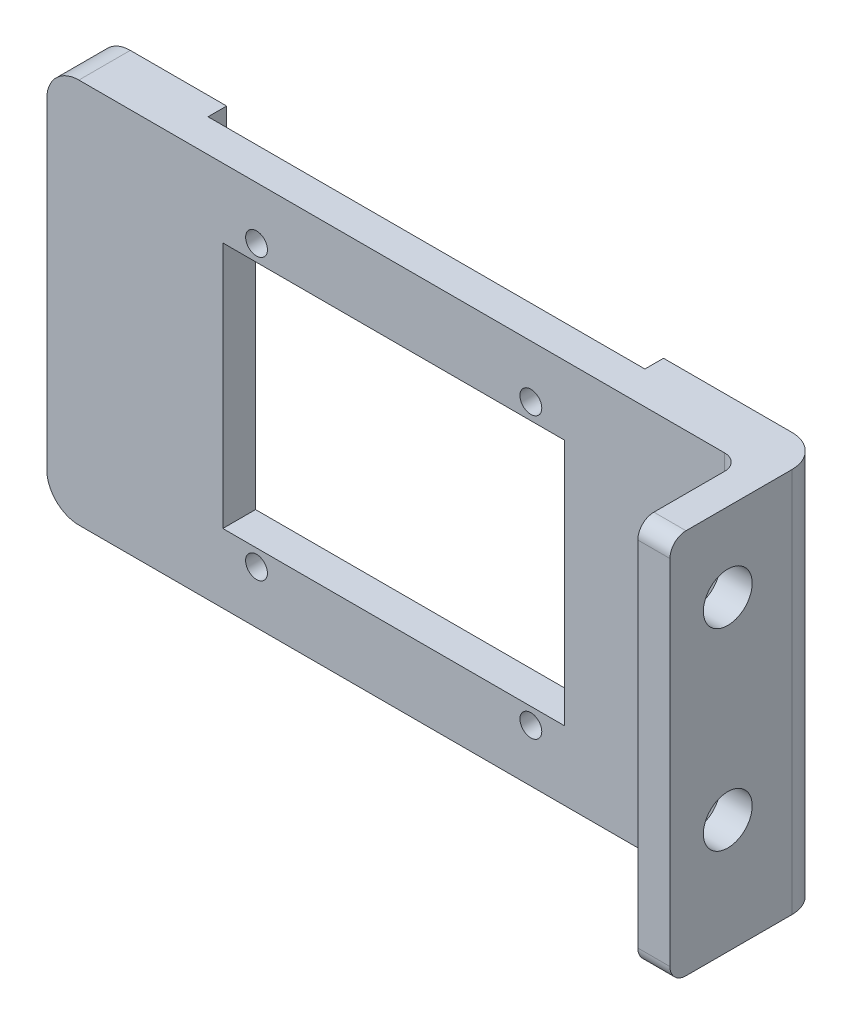
ISO-10303-21;
HEADER;
FILE_DESCRIPTION(('STEP AP214'),'2;1');
FILE_NAME('part.step','',(''),(''),'','','');
FILE_SCHEMA(('AUTOMOTIVE_DESIGN { 1 0 10303 214 1 1 1 1 }'));
ENDSEC;
DATA;
#1=APPLICATION_CONTEXT('core data for automotive mechanical design processes');
#2=APPLICATION_PROTOCOL_DEFINITION('international standard','automotive_design',2000,#1);
#3=PRODUCT_CONTEXT('',#1,'mechanical');
#4=PRODUCT('Part','Part','',(#3));
#5=PRODUCT_RELATED_PRODUCT_CATEGORY('part','',(#4));
#6=PRODUCT_DEFINITION_FORMATION('','',#4);
#7=PRODUCT_DEFINITION_CONTEXT('part definition',#1,'design');
#8=PRODUCT_DEFINITION('design','',#6,#7);
#9=PRODUCT_DEFINITION_SHAPE('','',#8);
#10=(LENGTH_UNIT() NAMED_UNIT(*) SI_UNIT(.MILLI.,.METRE.));
#11=(NAMED_UNIT(*) PLANE_ANGLE_UNIT() SI_UNIT($,.RADIAN.));
#12=(NAMED_UNIT(*) SI_UNIT($,.STERADIAN.) SOLID_ANGLE_UNIT());
#13=UNCERTAINTY_MEASURE_WITH_UNIT(LENGTH_MEASURE(1.E-05),#10,'distance_accuracy_value','');
#14=(GEOMETRIC_REPRESENTATION_CONTEXT(3) GLOBAL_UNCERTAINTY_ASSIGNED_CONTEXT((#13)) GLOBAL_UNIT_ASSIGNED_CONTEXT((#10,
#11,#12)) REPRESENTATION_CONTEXT('',''));
#15=CARTESIAN_POINT('',(0.,0.,0.));
#16=DIRECTION('',(0.,0.,1.));
#17=DIRECTION('',(1.,0.,0.));
#18=AXIS2_PLACEMENT_3D('',#15,#16,#17);
#19=CARTESIAN_POINT('',(-27.,-18.485,-1.44999999999999));
#20=DIRECTION('',(-1.,0.,0.));
#21=DIRECTION('',(0.,-1.,0.));
#22=AXIS2_PLACEMENT_3D('',#19,#20,#21);
#23=PLANE('',#22);
#24=DIRECTION('',(0.,1.,0.));
#25=VECTOR('',#24,1.);
#26=CARTESIAN_POINT('',(-27.,-18.485,2.55000000000001));
#27=LINE('',#26,#25);
#28=CARTESIAN_POINT('',(-27.,-15.985,2.55000000000001));
#29=VERTEX_POINT('',#28);
#30=CARTESIAN_POINT('',(-27.,9.015,2.55000000000001));
#31=VERTEX_POINT('',#30);
#32=EDGE_CURVE('E269',#29,#31,#27,.T.);
#33=ORIENTED_EDGE('',*,*,#32,.T.);
#34=DIRECTION('',(0.,0.,1.));
#35=VECTOR('',#34,1.);
#36=CARTESIAN_POINT('',(-27.,9.015,-1.44999999999999));
#37=LINE('',#36,#35);
#38=CARTESIAN_POINT('',(-27.,9.015,-1.44999999999999));
#39=VERTEX_POINT('',#38);
#40=EDGE_CURVE('E357',#31,#39,#37,.F.);
#41=ORIENTED_EDGE('',*,*,#40,.T.);
#42=DIRECTION('',(0.,1.,0.));
#43=VECTOR('',#42,1.);
#44=CARTESIAN_POINT('',(-27.,-18.485,-1.44999999999999));
#45=LINE('',#44,#43);
#46=CARTESIAN_POINT('',(-27.,-15.985,-1.44999999999999));
#47=VERTEX_POINT('',#46);
#48=EDGE_CURVE('E298',#47,#39,#45,.T.);
#49=ORIENTED_EDGE('',*,*,#48,.F.);
#50=DIRECTION('',(0.,0.,1.));
#51=VECTOR('',#50,1.);
#52=CARTESIAN_POINT('',(-27.,-15.985,2.55000000000001));
#53=LINE('',#52,#51);
#54=EDGE_CURVE('E353',#47,#29,#53,.T.);
#55=ORIENTED_EDGE('',*,*,#54,.T.);
#56=EDGE_LOOP('',(#33,#41,#49,#55));
#57=FACE_BOUND('',#56,.T.);
#58=ADVANCED_FACE('F39',(#57),#23,.T.);
#59=CARTESIAN_POINT('',(-27.,-18.485,-1.44999999999999));
#60=DIRECTION('',(0.,0.,-1.));
#61=DIRECTION('',(-1.,0.,0.));
#62=AXIS2_PLACEMENT_3D('',#59,#60,#61);
#63=PLANE('',#62);
#64=ORIENTED_EDGE('',*,*,#48,.T.);
#65=CARTESIAN_POINT('',(-24.5,9.015,-1.44999999999999));
#66=DIRECTION('',(0.,0.,-1.));
#67=DIRECTION('',(-1.,0.,0.));
#68=AXIS2_PLACEMENT_3D('',#65,#66,#67);
#69=CIRCLE('',#68,2.5);
#70=CARTESIAN_POINT('',(-24.5,11.515,-1.44999999999999));
#71=VERTEX_POINT('',#70);
#72=EDGE_CURVE('E363',#39,#71,#69,.T.);
#73=ORIENTED_EDGE('',*,*,#72,.T.);
#74=DIRECTION('',(-1.,0.,0.));
#75=VECTOR('',#74,1.);
#76=CARTESIAN_POINT('',(-27.,11.515,-1.44999999999999));
#77=LINE('',#76,#75);
#78=CARTESIAN_POINT('',(-17.,11.515,-1.44999999999999));
#79=VERTEX_POINT('',#78);
#80=EDGE_CURVE('E243',#79,#71,#77,.T.);
#81=ORIENTED_EDGE('',*,*,#80,.F.);
#82=DIRECTION('',(0.,1.,0.));
#83=VECTOR('',#82,1.);
#84=CARTESIAN_POINT('',(-17.,-18.485,-1.44999999999999));
#85=LINE('',#84,#83);
#86=CARTESIAN_POINT('',(-17.,-18.485,-1.44999999999999));
#87=VERTEX_POINT('',#86);
#88=EDGE_CURVE('E303',#87,#79,#85,.T.);
#89=ORIENTED_EDGE('',*,*,#88,.F.);
#90=DIRECTION('',(-1.,0.,0.));
#91=VECTOR('',#90,1.);
#92=CARTESIAN_POINT('',(-27.,-18.485,-1.44999999999999));
#93=LINE('',#92,#91);
#94=CARTESIAN_POINT('',(-24.5,-18.485,-1.44999999999999));
#95=VERTEX_POINT('',#94);
#96=EDGE_CURVE('E265',#87,#95,#93,.T.);
#97=ORIENTED_EDGE('',*,*,#96,.T.);
#98=CARTESIAN_POINT('',(-24.5,-15.985,-1.44999999999999));
#99=DIRECTION('',(0.,0.,-1.));
#100=DIRECTION('',(-1.,0.,0.));
#101=AXIS2_PLACEMENT_3D('',#98,#99,#100);
#102=CIRCLE('',#101,2.5);
#103=EDGE_CURVE('E360',#95,#47,#102,.T.);
#104=ORIENTED_EDGE('',*,*,#103,.T.);
#105=EDGE_LOOP('',(#64,#73,#81,#89,#97,#104));
#106=FACE_BOUND('',#105,.T.);
#107=ADVANCED_FACE('F451',(#106),#63,.T.);
#108=CARTESIAN_POINT('',(-17.,-18.485,-1.44999999999999));
#109=DIRECTION('',(1.,0.,0.));
#110=DIRECTION('',(0.,1.,0.));
#111=AXIS2_PLACEMENT_3D('',#108,#109,#110);
#112=PLANE('',#111);
#113=DIRECTION('',(0.,0.,-1.));
#114=VECTOR('',#113,1.);
#115=CARTESIAN_POINT('',(-17.,11.515,-1.44999999999999));
#116=LINE('',#115,#114);
#117=CARTESIAN_POINT('',(-17.,11.515,0.));
#118=VERTEX_POINT('',#117);
#119=EDGE_CURVE('E291',#118,#79,#116,.T.);
#120=ORIENTED_EDGE('',*,*,#119,.F.);
#121=DIRECTION('',(0.,1.,0.));
#122=VECTOR('',#121,1.);
#123=CARTESIAN_POINT('',(-17.,-18.485,0.));
#124=LINE('',#123,#122);
#125=CARTESIAN_POINT('',(-17.,-18.485,0.));
#126=VERTEX_POINT('',#125);
#127=EDGE_CURVE('E306',#126,#118,#124,.T.);
#128=ORIENTED_EDGE('',*,*,#127,.F.);
#129=DIRECTION('',(0.,0.,-1.));
#130=VECTOR('',#129,1.);
#131=CARTESIAN_POINT('',(-17.,-18.485,-1.44999999999999));
#132=LINE('',#131,#130);
#133=EDGE_CURVE('E261',#126,#87,#132,.T.);
#134=ORIENTED_EDGE('',*,*,#133,.T.);
#135=ORIENTED_EDGE('',*,*,#88,.T.);
#136=EDGE_LOOP('',(#120,#128,#134,#135));
#137=FACE_BOUND('',#136,.T.);
#138=ADVANCED_FACE('F448',(#137),#112,.T.);
#139=CARTESIAN_POINT('',(-17.,-18.485,0.));
#140=DIRECTION('',(0.,0.,-1.));
#141=DIRECTION('',(-1.,0.,0.));
#142=AXIS2_PLACEMENT_3D('',#139,#140,#141);
#143=PLANE('',#142);
#144=CARTESIAN_POINT('',(-10.675,7.41500000000001,0.));
#145=DIRECTION('',(0.,0.,-1.));
#146=DIRECTION('',(1.,0.,0.));
#147=AXIS2_PLACEMENT_3D('',#144,#145,#146);
#148=CIRCLE('',#147,0.85);
#149=CARTESIAN_POINT('',(-9.825,7.41500000000001,0.));
#150=VERTEX_POINT('',#149);
#151=EDGE_CURVE('E719',#150,#150,#148,.T.);
#152=ORIENTED_EDGE('',*,*,#151,.F.);
#153=EDGE_LOOP('',(#152));
#154=FACE_BOUND('',#153,.T.);
#155=CARTESIAN_POINT('',(-10.675,-14.385,0.));
#156=DIRECTION('',(0.,0.,-1.));
#157=DIRECTION('',(-1.,0.,0.));
#158=AXIS2_PLACEMENT_3D('',#155,#156,#157);
#159=CIRCLE('',#158,0.85);
#160=CARTESIAN_POINT('',(-11.525,-14.385,0.));
#161=VERTEX_POINT('',#160);
#162=EDGE_CURVE('E726',#161,#161,#159,.T.);
#163=ORIENTED_EDGE('',*,*,#162,.F.);
#164=EDGE_LOOP('',(#163));
#165=FACE_BOUND('',#164,.T.);
#166=CARTESIAN_POINT('',(10.675,-14.385,0.));
#167=DIRECTION('',(0.,0.,-1.));
#168=DIRECTION('',(1.,0.,0.));
#169=AXIS2_PLACEMENT_3D('',#166,#167,#168);
#170=CIRCLE('',#169,0.85);
#171=CARTESIAN_POINT('',(11.525,-14.385,0.));
#172=VERTEX_POINT('',#171);
#173=EDGE_CURVE('E738',#172,#172,#170,.T.);
#174=ORIENTED_EDGE('',*,*,#173,.F.);
#175=EDGE_LOOP('',(#174));
#176=FACE_BOUND('',#175,.T.);
#177=CARTESIAN_POINT('',(10.675,7.415,0.));
#178=DIRECTION('',(0.,0.,-1.));
#179=DIRECTION('',(-1.,0.,0.));
#180=AXIS2_PLACEMENT_3D('',#177,#178,#179);
#181=CIRCLE('',#180,0.85);
#182=CARTESIAN_POINT('',(9.825,7.415,0.));
#183=VERTEX_POINT('',#182);
#184=EDGE_CURVE('E731',#183,#183,#181,.T.);
#185=ORIENTED_EDGE('',*,*,#184,.F.);
#186=EDGE_LOOP('',(#185));
#187=FACE_BOUND('',#186,.T.);
#188=DIRECTION('',(0.,1.,0.));
#189=VECTOR('',#188,1.);
#190=CARTESIAN_POINT('',(-13.3,-13.11,0.));
#191=LINE('',#190,#189);
#192=CARTESIAN_POINT('',(-13.3,-13.11,0.));
#193=VERTEX_POINT('',#192);
#194=CARTESIAN_POINT('',(-13.3,6.14000000000001,0.));
#195=VERTEX_POINT('',#194);
#196=EDGE_CURVE('E55',#193,#195,#191,.T.);
#197=ORIENTED_EDGE('',*,*,#196,.F.);
#198=DIRECTION('',(-1.,0.,0.));
#199=VECTOR('',#198,1.);
#200=CARTESIAN_POINT('',(13.3,-13.11,0.));
#201=LINE('',#200,#199);
#202=CARTESIAN_POINT('',(13.3,-13.11,0.));
#203=VERTEX_POINT('',#202);
#204=EDGE_CURVE('E190',#203,#193,#201,.T.);
#205=ORIENTED_EDGE('',*,*,#204,.F.);
#206=DIRECTION('',(0.,-1.,0.));
#207=VECTOR('',#206,1.);
#208=CARTESIAN_POINT('',(13.3,-13.11,0.));
#209=LINE('',#208,#207);
#210=CARTESIAN_POINT('',(13.3,6.14000000000001,0.));
#211=VERTEX_POINT('',#210);
#212=EDGE_CURVE('E208',#211,#203,#209,.T.);
#213=ORIENTED_EDGE('',*,*,#212,.F.);
#214=DIRECTION('',(1.,0.,0.));
#215=VECTOR('',#214,1.);
#216=CARTESIAN_POINT('',(13.3,6.14000000000001,0.));
#217=LINE('',#216,#215);
#218=EDGE_CURVE('E200',#195,#211,#217,.T.);
#219=ORIENTED_EDGE('',*,*,#218,.F.);
#220=EDGE_LOOP('',(#197,#205,#213,#219));
#221=FACE_BOUND('',#220,.T.);
#222=DIRECTION('',(-1.,0.,0.));
#223=VECTOR('',#222,1.);
#224=CARTESIAN_POINT('',(-17.,11.515,0.));
#225=LINE('',#224,#223);
#226=CARTESIAN_POINT('',(17.,11.515,0.));
#227=VERTEX_POINT('',#226);
#228=EDGE_CURVE('E287',#227,#118,#225,.T.);
#229=ORIENTED_EDGE('',*,*,#228,.F.);
#230=DIRECTION('',(0.,1.,0.));
#231=VECTOR('',#230,1.);
#232=CARTESIAN_POINT('',(17.,-18.485,0.));
#233=LINE('',#232,#231);
#234=CARTESIAN_POINT('',(17.,-18.485,0.));
#235=VERTEX_POINT('',#234);
#236=EDGE_CURVE('E309',#235,#227,#233,.T.);
#237=ORIENTED_EDGE('',*,*,#236,.F.);
#238=DIRECTION('',(-1.,0.,0.));
#239=VECTOR('',#238,1.);
#240=CARTESIAN_POINT('',(-17.,-18.485,0.));
#241=LINE('',#240,#239);
#242=EDGE_CURVE('E257',#235,#126,#241,.T.);
#243=ORIENTED_EDGE('',*,*,#242,.T.);
#244=ORIENTED_EDGE('',*,*,#127,.T.);
#245=EDGE_LOOP('',(#229,#237,#243,#244));
#246=FACE_BOUND('',#245,.T.);
#247=ADVANCED_FACE('F444',(#154,#165,#176,#187,#221,#246),#143,.T.);
#248=CARTESIAN_POINT('',(17.,-18.485,0.));
#249=DIRECTION('',(-1.,0.,0.));
#250=DIRECTION('',(0.,-1.,0.));
#251=AXIS2_PLACEMENT_3D('',#248,#249,#250);
#252=PLANE('',#251);
#253=DIRECTION('',(0.,0.,1.));
#254=VECTOR('',#253,1.);
#255=CARTESIAN_POINT('',(17.,11.515,0.));
#256=LINE('',#255,#254);
#257=CARTESIAN_POINT('',(17.,11.515,-1.44999999999999));
#258=VERTEX_POINT('',#257);
#259=EDGE_CURVE('E283',#258,#227,#256,.T.);
#260=ORIENTED_EDGE('',*,*,#259,.F.);
#261=DIRECTION('',(0.,1.,0.));
#262=VECTOR('',#261,1.);
#263=CARTESIAN_POINT('',(17.,-18.485,-1.44999999999999));
#264=LINE('',#263,#262);
#265=CARTESIAN_POINT('',(17.,-18.485,-1.44999999999999));
#266=VERTEX_POINT('',#265);
#267=EDGE_CURVE('E312',#266,#258,#264,.T.);
#268=ORIENTED_EDGE('',*,*,#267,.F.);
#269=DIRECTION('',(0.,0.,1.));
#270=VECTOR('',#269,1.);
#271=CARTESIAN_POINT('',(17.,-18.485,0.));
#272=LINE('',#271,#270);
#273=EDGE_CURVE('E253',#266,#235,#272,.T.);
#274=ORIENTED_EDGE('',*,*,#273,.T.);
#275=ORIENTED_EDGE('',*,*,#236,.T.);
#276=EDGE_LOOP('',(#260,#268,#274,#275));
#277=FACE_BOUND('',#276,.T.);
#278=ADVANCED_FACE('F439',(#277),#252,.T.);
#279=CARTESIAN_POINT('',(17.,-18.485,-1.44999999999999));
#280=DIRECTION('',(0.,0.,-1.));
#281=DIRECTION('',(-1.,0.,0.));
#282=AXIS2_PLACEMENT_3D('',#279,#280,#281);
#283=PLANE('',#282);
#284=DIRECTION('',(-1.,0.,0.));
#285=VECTOR('',#284,1.);
#286=CARTESIAN_POINT('',(17.,11.515,-1.44999999999999));
#287=LINE('',#286,#285);
#288=CARTESIAN_POINT('',(27.,11.515,-1.44999999999999));
#289=VERTEX_POINT('',#288);
#290=EDGE_CURVE('E280',#289,#258,#287,.T.);
#291=ORIENTED_EDGE('',*,*,#290,.F.);
#292=DIRECTION('',(0.,1.,0.));
#293=VECTOR('',#292,1.);
#294=CARTESIAN_POINT('',(27.,-18.485,-1.44999999999999));
#295=LINE('',#294,#293);
#296=CARTESIAN_POINT('',(27.,-18.485,-1.44999999999999));
#297=VERTEX_POINT('',#296);
#298=EDGE_CURVE('E337',#289,#297,#295,.F.);
#299=ORIENTED_EDGE('',*,*,#298,.T.);
#300=DIRECTION('',(-1.,0.,0.));
#301=VECTOR('',#300,1.);
#302=CARTESIAN_POINT('',(17.,-18.485,-1.44999999999999));
#303=LINE('',#302,#301);
#304=EDGE_CURVE('E250',#297,#266,#303,.T.);
#305=ORIENTED_EDGE('',*,*,#304,.T.);
#306=ORIENTED_EDGE('',*,*,#267,.T.);
#307=EDGE_LOOP('',(#291,#299,#305,#306));
#308=FACE_BOUND('',#307,.T.);
#309=ADVANCED_FACE('F435',(#308),#283,.T.);
#310=CARTESIAN_POINT('',(29.5,-18.485,10.55));
#311=DIRECTION('',(1.,0.,0.));
#312=DIRECTION('',(0.,1.,0.));
#313=AXIS2_PLACEMENT_3D('',#310,#311,#312);
#314=PLANE('',#313);
#315=CARTESIAN_POINT('',(29.5,-9.59500000000001,6.05000000000001));
#316=DIRECTION('',(1.,0.,0.));
#317=DIRECTION('',(0.,0.,-1.));
#318=AXIS2_PLACEMENT_3D('',#315,#316,#317);
#319=CIRCLE('',#318,1.89999999999999);
#320=CARTESIAN_POINT('',(29.5,-9.59500000000001,4.15000000000001));
#321=VERTEX_POINT('',#320);
#322=EDGE_CURVE('E183',#321,#321,#319,.T.);
#323=ORIENTED_EDGE('',*,*,#322,.F.);
#324=EDGE_LOOP('',(#323));
#325=FACE_BOUND('',#324,.T.);
#326=CARTESIAN_POINT('',(29.5,5.40499999999999,6.05000000000001));
#327=DIRECTION('',(1.,0.,0.));
#328=DIRECTION('',(0.,0.,-1.));
#329=AXIS2_PLACEMENT_3D('',#326,#327,#328);
#330=CIRCLE('',#329,1.89999999999999);
#331=CARTESIAN_POINT('',(29.5,5.40499999999999,4.15000000000001));
#332=VERTEX_POINT('',#331);
#333=EDGE_CURVE('E229',#332,#332,#330,.T.);
#334=ORIENTED_EDGE('',*,*,#333,.F.);
#335=EDGE_LOOP('',(#334));
#336=FACE_BOUND('',#335,.T.);
#337=DIRECTION('',(0.,0.,-1.));
#338=VECTOR('',#337,1.);
#339=CARTESIAN_POINT('',(29.5,11.515,10.55));
#340=LINE('',#339,#338);
#341=CARTESIAN_POINT('',(29.5,11.515,9.30000000000001));
#342=VERTEX_POINT('',#341);
#343=CARTESIAN_POINT('',(29.5,11.515,1.05000000000001));
#344=VERTEX_POINT('',#343);
#345=EDGE_CURVE('E277',#342,#344,#340,.T.);
#346=ORIENTED_EDGE('',*,*,#345,.F.);
#347=CARTESIAN_POINT('',(29.5,10.265,9.30000000000001));
#348=DIRECTION('',(1.,0.,0.));
#349=DIRECTION('',(0.,1.,0.));
#350=AXIS2_PLACEMENT_3D('',#347,#348,#349);
#351=CIRCLE('',#350,1.25);
#352=CARTESIAN_POINT('',(29.5,10.265,10.55));
#353=VERTEX_POINT('',#352);
#354=EDGE_CURVE('E386',#342,#353,#351,.T.);
#355=ORIENTED_EDGE('',*,*,#354,.T.);
#356=DIRECTION('',(0.,1.,0.));
#357=VECTOR('',#356,1.);
#358=CARTESIAN_POINT('',(29.5,-18.485,10.55));
#359=LINE('',#358,#357);
#360=CARTESIAN_POINT('',(29.5,-17.235,10.55));
#361=VERTEX_POINT('',#360);
#362=EDGE_CURVE('E316',#361,#353,#359,.T.);
#363=ORIENTED_EDGE('',*,*,#362,.F.);
#364=CARTESIAN_POINT('',(29.5,-17.235,9.30000000000001));
#365=DIRECTION('',(1.,0.,0.));
#366=DIRECTION('',(0.,1.,0.));
#367=AXIS2_PLACEMENT_3D('',#364,#365,#366);
#368=CIRCLE('',#367,1.25);
#369=CARTESIAN_POINT('',(29.5,-18.485,9.30000000000001));
#370=VERTEX_POINT('',#369);
#371=EDGE_CURVE('E383',#361,#370,#368,.T.);
#372=ORIENTED_EDGE('',*,*,#371,.T.);
#373=DIRECTION('',(0.,0.,-1.));
#374=VECTOR('',#373,1.);
#375=CARTESIAN_POINT('',(29.5,-18.485,10.55));
#376=LINE('',#375,#374);
#377=CARTESIAN_POINT('',(29.5,-18.485,1.05000000000001));
#378=VERTEX_POINT('',#377);
#379=EDGE_CURVE('E247',#370,#378,#376,.T.);
#380=ORIENTED_EDGE('',*,*,#379,.T.);
#381=DIRECTION('',(0.,1.,0.));
#382=VECTOR('',#381,1.);
#383=CARTESIAN_POINT('',(29.5,-18.485,1.05000000000001));
#384=LINE('',#383,#382);
#385=EDGE_CURVE('E302',#378,#344,#384,.T.);
#386=ORIENTED_EDGE('',*,*,#385,.T.);
#387=EDGE_LOOP('',(#346,#355,#363,#372,#380,#386));
#388=FACE_BOUND('',#387,.T.);
#389=ADVANCED_FACE('F414',(#325,#336,#388),#314,.T.);
#390=CARTESIAN_POINT('',(27.,-18.485,10.55));
#391=DIRECTION('',(0.,0.,1.));
#392=DIRECTION('',(1.,0.,0.));
#393=AXIS2_PLACEMENT_3D('',#390,#391,#392);
#394=PLANE('',#393);
#395=ORIENTED_EDGE('',*,*,#362,.T.);
#396=DIRECTION('',(1.,0.,0.));
#397=VECTOR('',#396,1.);
#398=CARTESIAN_POINT('',(27.,10.265,10.55));
#399=LINE('',#398,#397);
#400=CARTESIAN_POINT('',(27.,10.265,10.55));
#401=VERTEX_POINT('',#400);
#402=EDGE_CURVE('E393',#353,#401,#399,.F.);
#403=ORIENTED_EDGE('',*,*,#402,.T.);
#404=DIRECTION('',(0.,1.,0.));
#405=VECTOR('',#404,1.);
#406=CARTESIAN_POINT('',(27.,-18.485,10.55));
#407=LINE('',#406,#405);
#408=CARTESIAN_POINT('',(27.,-17.235,10.55));
#409=VERTEX_POINT('',#408);
#410=EDGE_CURVE('E320',#409,#401,#407,.T.);
#411=ORIENTED_EDGE('',*,*,#410,.F.);
#412=DIRECTION('',(1.,0.,0.));
#413=VECTOR('',#412,1.);
#414=CARTESIAN_POINT('',(29.5,-17.235,10.55));
#415=LINE('',#414,#413);
#416=EDGE_CURVE('E389',#409,#361,#415,.T.);
#417=ORIENTED_EDGE('',*,*,#416,.T.);
#418=EDGE_LOOP('',(#395,#403,#411,#417));
#419=FACE_BOUND('',#418,.T.);
#420=ADVANCED_FACE('F416',(#419),#394,.T.);
#421=CARTESIAN_POINT('',(27.,-18.485,2.55000000000001));
#422=DIRECTION('',(-1.,0.,0.));
#423=DIRECTION('',(0.,0.,1.));
#424=AXIS2_PLACEMENT_3D('',#421,#422,#423);
#425=PLANE('',#424);
#426=CARTESIAN_POINT('',(27.,-9.59500000000001,6.05000000000001));
#427=DIRECTION('',(-1.,0.,0.));
#428=DIRECTION('',(0.,0.,1.));
#429=AXIS2_PLACEMENT_3D('',#426,#427,#428);
#430=CIRCLE('',#429,1.89999999999999);
#431=CARTESIAN_POINT('',(27.,-9.59500000000001,7.94999999999999));
#432=VERTEX_POINT('',#431);
#433=EDGE_CURVE('E225',#432,#432,#430,.T.);
#434=ORIENTED_EDGE('',*,*,#433,.F.);
#435=EDGE_LOOP('',(#434));
#436=FACE_BOUND('',#435,.T.);
#437=CARTESIAN_POINT('',(27.,5.40499999999999,6.05000000000001));
#438=DIRECTION('',(-1.,0.,0.));
#439=DIRECTION('',(0.,0.,1.));
#440=AXIS2_PLACEMENT_3D('',#437,#438,#439);
#441=CIRCLE('',#440,1.89999999999999);
#442=CARTESIAN_POINT('',(27.,5.40499999999999,7.95));
#443=VERTEX_POINT('',#442);
#444=EDGE_CURVE('E233',#443,#443,#441,.T.);
#445=ORIENTED_EDGE('',*,*,#444,.F.);
#446=EDGE_LOOP('',(#445));
#447=FACE_BOUND('',#446,.T.);
#448=ORIENTED_EDGE('',*,*,#410,.T.);
#449=CARTESIAN_POINT('',(27.,10.265,9.30000000000001));
#450=DIRECTION('',(-1.,0.,0.));
#451=DIRECTION('',(0.,0.,1.));
#452=AXIS2_PLACEMENT_3D('',#449,#450,#451);
#453=CIRCLE('',#452,1.25);
#454=CARTESIAN_POINT('',(27.,11.515,9.30000000000001));
#455=VERTEX_POINT('',#454);
#456=EDGE_CURVE('E48',#401,#455,#453,.T.);
#457=ORIENTED_EDGE('',*,*,#456,.T.);
#458=DIRECTION('',(0.,0.,1.));
#459=VECTOR('',#458,1.);
#460=CARTESIAN_POINT('',(27.,11.515,2.55000000000001));
#461=LINE('',#460,#459);
#462=CARTESIAN_POINT('',(27.,11.515,3.80000000000001));
#463=VERTEX_POINT('',#462);
#464=EDGE_CURVE('E273',#463,#455,#461,.T.);
#465=ORIENTED_EDGE('',*,*,#464,.F.);
#466=DIRECTION('',(0.,1.,0.));
#467=VECTOR('',#466,1.);
#468=CARTESIAN_POINT('',(27.,-18.485,3.80000000000001));
#469=LINE('',#468,#467);
#470=CARTESIAN_POINT('',(27.,-18.485,3.80000000000001));
#471=VERTEX_POINT('',#470);
#472=EDGE_CURVE('E370',#463,#471,#469,.F.);
#473=ORIENTED_EDGE('',*,*,#472,.T.);
#474=DIRECTION('',(0.,0.,1.));
#475=VECTOR('',#474,1.);
#476=CARTESIAN_POINT('',(27.,-18.485,2.55000000000001));
#477=LINE('',#476,#475);
#478=CARTESIAN_POINT('',(27.,-18.485,9.30000000000001));
#479=VERTEX_POINT('',#478);
#480=EDGE_CURVE('E242',#471,#479,#477,.T.);
#481=ORIENTED_EDGE('',*,*,#480,.T.);
#482=CARTESIAN_POINT('',(27.,-17.235,9.30000000000001));
#483=DIRECTION('',(-1.,0.,0.));
#484=DIRECTION('',(0.,0.,1.));
#485=AXIS2_PLACEMENT_3D('',#482,#483,#484);
#486=CIRCLE('',#485,1.25);
#487=EDGE_CURVE('E396',#479,#409,#486,.T.);
#488=ORIENTED_EDGE('',*,*,#487,.T.);
#489=EDGE_LOOP('',(#448,#457,#465,#473,#481,#488));
#490=FACE_BOUND('',#489,.T.);
#491=ADVANCED_FACE('F402',(#436,#447,#490),#425,.T.);
#492=CARTESIAN_POINT('',(-27.,-18.485,2.55000000000001));
#493=DIRECTION('',(0.,0.,1.));
#494=DIRECTION('',(1.,0.,0.));
#495=AXIS2_PLACEMENT_3D('',#492,#493,#494);
#496=PLANE('',#495);
#497=CARTESIAN_POINT('',(-10.675,7.41500000000001,2.55000000000001));
#498=DIRECTION('',(0.,0.,1.));
#499=DIRECTION('',(1.,0.,0.));
#500=AXIS2_PLACEMENT_3D('',#497,#498,#499);
#501=CIRCLE('',#500,0.85);
#502=CARTESIAN_POINT('',(-9.825,7.41500000000001,2.55000000000001));
#503=VERTEX_POINT('',#502);
#504=EDGE_CURVE('E716',#503,#503,#501,.F.);
#505=ORIENTED_EDGE('',*,*,#504,.T.);
#506=EDGE_LOOP('',(#505));
#507=FACE_BOUND('',#506,.T.);
#508=CARTESIAN_POINT('',(-10.675,-14.385,2.55000000000001));
#509=DIRECTION('',(0.,0.,1.));
#510=DIRECTION('',(1.,0.,0.));
#511=AXIS2_PLACEMENT_3D('',#508,#509,#510);
#512=CIRCLE('',#511,0.85);
#513=CARTESIAN_POINT('',(-9.82500000000001,-14.385,2.55000000000001));
#514=VERTEX_POINT('',#513);
#515=EDGE_CURVE('E721',#514,#514,#512,.F.);
#516=ORIENTED_EDGE('',*,*,#515,.T.);
#517=EDGE_LOOP('',(#516));
#518=FACE_BOUND('',#517,.T.);
#519=CARTESIAN_POINT('',(10.675,-14.385,2.55000000000001));
#520=DIRECTION('',(0.,0.,1.));
#521=DIRECTION('',(1.,0.,0.));
#522=AXIS2_PLACEMENT_3D('',#519,#520,#521);
#523=CIRCLE('',#522,0.85);
#524=CARTESIAN_POINT('',(11.525,-14.385,2.55000000000001));
#525=VERTEX_POINT('',#524);
#526=EDGE_CURVE('E747',#525,#525,#523,.F.);
#527=ORIENTED_EDGE('',*,*,#526,.T.);
#528=EDGE_LOOP('',(#527));
#529=FACE_BOUND('',#528,.T.);
#530=CARTESIAN_POINT('',(10.675,7.415,2.55000000000001));
#531=DIRECTION('',(0.,0.,1.));
#532=DIRECTION('',(1.,0.,0.));
#533=AXIS2_PLACEMENT_3D('',#530,#531,#532);
#534=CIRCLE('',#533,0.85);
#535=CARTESIAN_POINT('',(11.525,7.415,2.55000000000001));
#536=VERTEX_POINT('',#535);
#537=EDGE_CURVE('E735',#536,#536,#534,.F.);
#538=ORIENTED_EDGE('',*,*,#537,.T.);
#539=EDGE_LOOP('',(#538));
#540=FACE_BOUND('',#539,.T.);
#541=DIRECTION('',(0.,1.,0.));
#542=VECTOR('',#541,1.);
#543=CARTESIAN_POINT('',(-13.3,-13.11,2.55000000000001));
#544=LINE('',#543,#542);
#545=CARTESIAN_POINT('',(-13.3,-13.11,2.55000000000001));
#546=VERTEX_POINT('',#545);
#547=CARTESIAN_POINT('',(-13.3,6.14000000000001,2.55000000000001));
#548=VERTEX_POINT('',#547);
#549=EDGE_CURVE('E187',#546,#548,#544,.T.);
#550=ORIENTED_EDGE('',*,*,#549,.T.);
#551=DIRECTION('',(1.,0.,0.));
#552=VECTOR('',#551,1.);
#553=CARTESIAN_POINT('',(13.3,6.14000000000001,2.55000000000001));
#554=LINE('',#553,#552);
#555=CARTESIAN_POINT('',(13.3,6.14000000000001,2.55000000000001));
#556=VERTEX_POINT('',#555);
#557=EDGE_CURVE('E175',#548,#556,#554,.T.);
#558=ORIENTED_EDGE('',*,*,#557,.T.);
#559=DIRECTION('',(0.,-1.,0.));
#560=VECTOR('',#559,1.);
#561=CARTESIAN_POINT('',(13.3,-13.11,2.55000000000001));
#562=LINE('',#561,#560);
#563=CARTESIAN_POINT('',(13.3,-13.11,2.55000000000001));
#564=VERTEX_POINT('',#563);
#565=EDGE_CURVE('E202',#556,#564,#562,.T.);
#566=ORIENTED_EDGE('',*,*,#565,.T.);
#567=DIRECTION('',(-1.,0.,0.));
#568=VECTOR('',#567,1.);
#569=CARTESIAN_POINT('',(13.3,-13.11,2.55000000000001));
#570=LINE('',#569,#568);
#571=EDGE_CURVE('E195',#564,#546,#570,.T.);
#572=ORIENTED_EDGE('',*,*,#571,.T.);
#573=EDGE_LOOP('',(#550,#558,#566,#572));
#574=FACE_BOUND('',#573,.T.);
#575=DIRECTION('',(1.,0.,0.));
#576=VECTOR('',#575,1.);
#577=CARTESIAN_POINT('',(-27.,-18.485,2.55000000000001));
#578=LINE('',#577,#576);
#579=CARTESIAN_POINT('',(-24.5,-18.485,2.55000000000001));
#580=VERTEX_POINT('',#579);
#581=CARTESIAN_POINT('',(25.75,-18.485,2.55000000000001));
#582=VERTEX_POINT('',#581);
#583=EDGE_CURVE('E238',#580,#582,#578,.T.);
#584=ORIENTED_EDGE('',*,*,#583,.T.);
#585=DIRECTION('',(0.,1.,0.));
#586=VECTOR('',#585,1.);
#587=CARTESIAN_POINT('',(25.75,11.515,2.55000000000001));
#588=LINE('',#587,#586);
#589=CARTESIAN_POINT('',(25.75,11.515,2.55000000000001));
#590=VERTEX_POINT('',#589);
#591=EDGE_CURVE('E366',#582,#590,#588,.T.);
#592=ORIENTED_EDGE('',*,*,#591,.T.);
#593=DIRECTION('',(1.,0.,0.));
#594=VECTOR('',#593,1.);
#595=CARTESIAN_POINT('',(-27.,11.515,2.55000000000001));
#596=LINE('',#595,#594);
#597=CARTESIAN_POINT('',(-24.5,11.515,2.55000000000001));
#598=VERTEX_POINT('',#597);
#599=EDGE_CURVE('E237',#598,#590,#596,.T.);
#600=ORIENTED_EDGE('',*,*,#599,.F.);
#601=CARTESIAN_POINT('',(-24.5,9.015,2.55000000000001));
#602=DIRECTION('',(0.,0.,1.));
#603=DIRECTION('',(1.,0.,0.));
#604=AXIS2_PLACEMENT_3D('',#601,#602,#603);
#605=CIRCLE('',#604,2.5);
#606=EDGE_CURVE('E350',#598,#31,#605,.T.);
#607=ORIENTED_EDGE('',*,*,#606,.T.);
#608=ORIENTED_EDGE('',*,*,#32,.F.);
#609=CARTESIAN_POINT('',(-24.5,-15.985,2.55000000000001));
#610=DIRECTION('',(0.,0.,1.));
#611=DIRECTION('',(1.,0.,0.));
#612=AXIS2_PLACEMENT_3D('',#609,#610,#611);
#613=CIRCLE('',#612,2.5);
#614=EDGE_CURVE('E347',#29,#580,#613,.T.);
#615=ORIENTED_EDGE('',*,*,#614,.T.);
#616=EDGE_LOOP('',(#584,#592,#600,#607,#608,#615));
#617=FACE_BOUND('',#616,.T.);
#618=ADVANCED_FACE('F193',(#507,#518,#529,#540,#574,#617),#496,.T.);
#619=CARTESIAN_POINT('',(0.,-18.485,0.));
#620=DIRECTION('',(0.,1.,0.));
#621=DIRECTION('',(-1.,0.,0.));
#622=AXIS2_PLACEMENT_3D('',#619,#620,#621);
#623=PLANE('',#622);
#624=ORIENTED_EDGE('',*,*,#379,.F.);
#625=DIRECTION('',(1.,0.,0.));
#626=VECTOR('',#625,1.);
#627=CARTESIAN_POINT('',(27.,-18.485,9.30000000000001));
#628=LINE('',#627,#626);
#629=EDGE_CURVE('E11',#370,#479,#628,.F.);
#630=ORIENTED_EDGE('',*,*,#629,.T.);
#631=ORIENTED_EDGE('',*,*,#480,.F.);
#632=CARTESIAN_POINT('',(25.75,-18.485,3.80000000000001));
#633=DIRECTION('',(0.,1.,0.));
#634=DIRECTION('',(-1.,0.,0.));
#635=AXIS2_PLACEMENT_3D('',#632,#633,#634);
#636=CIRCLE('',#635,1.25);
#637=EDGE_CURVE('E376',#471,#582,#636,.T.);
#638=ORIENTED_EDGE('',*,*,#637,.T.);
#639=ORIENTED_EDGE('',*,*,#583,.F.);
#640=DIRECTION('',(0.,0.,1.));
#641=VECTOR('',#640,1.);
#642=CARTESIAN_POINT('',(-24.5,-18.485,-1.44999999999999));
#643=LINE('',#642,#641);
#644=EDGE_CURVE('E340',#580,#95,#643,.F.);
#645=ORIENTED_EDGE('',*,*,#644,.T.);
#646=ORIENTED_EDGE('',*,*,#96,.F.);
#647=ORIENTED_EDGE('',*,*,#133,.F.);
#648=ORIENTED_EDGE('',*,*,#242,.F.);
#649=ORIENTED_EDGE('',*,*,#273,.F.);
#650=ORIENTED_EDGE('',*,*,#304,.F.);
#651=CARTESIAN_POINT('',(27.,-18.485,1.05000000000001));
#652=DIRECTION('',(0.,1.,0.));
#653=DIRECTION('',(-1.,0.,0.));
#654=AXIS2_PLACEMENT_3D('',#651,#652,#653);
#655=CIRCLE('',#654,2.5);
#656=EDGE_CURVE('E343',#297,#378,#655,.F.);
#657=ORIENTED_EDGE('',*,*,#656,.T.);
#658=EDGE_LOOP('',(#624,#630,#631,#638,#639,#645,#646,#647,#648,#649,#650,#657));
#659=FACE_BOUND('',#658,.T.);
#660=ADVANCED_FACE('F423',(#659),#623,.F.);
#661=CARTESIAN_POINT('',(0.,11.515,0.));
#662=DIRECTION('',(0.,1.,0.));
#663=DIRECTION('',(-1.,0.,0.));
#664=AXIS2_PLACEMENT_3D('',#661,#662,#663);
#665=PLANE('',#664);
#666=ORIENTED_EDGE('',*,*,#464,.T.);
#667=DIRECTION('',(1.,0.,0.));
#668=VECTOR('',#667,1.);
#669=CARTESIAN_POINT('',(0.,11.515,9.30000000000001));
#670=LINE('',#669,#668);
#671=EDGE_CURVE('E379',#455,#342,#670,.T.);
#672=ORIENTED_EDGE('',*,*,#671,.T.);
#673=ORIENTED_EDGE('',*,*,#345,.T.);
#674=CARTESIAN_POINT('',(27.,11.515,1.05000000000001));
#675=DIRECTION('',(0.,1.,0.));
#676=DIRECTION('',(-1.,0.,0.));
#677=AXIS2_PLACEMENT_3D('',#674,#675,#676);
#678=CIRCLE('',#677,2.5);
#679=EDGE_CURVE('E334',#344,#289,#678,.T.);
#680=ORIENTED_EDGE('',*,*,#679,.T.);
#681=ORIENTED_EDGE('',*,*,#290,.T.);
#682=ORIENTED_EDGE('',*,*,#259,.T.);
#683=ORIENTED_EDGE('',*,*,#228,.T.);
#684=ORIENTED_EDGE('',*,*,#119,.T.);
#685=ORIENTED_EDGE('',*,*,#80,.T.);
#686=DIRECTION('',(0.,0.,1.));
#687=VECTOR('',#686,1.);
#688=CARTESIAN_POINT('',(-24.5,11.515,0.));
#689=LINE('',#688,#687);
#690=EDGE_CURVE('E330',#71,#598,#689,.T.);
#691=ORIENTED_EDGE('',*,*,#690,.T.);
#692=ORIENTED_EDGE('',*,*,#599,.T.);
#693=CARTESIAN_POINT('',(25.75,11.515,3.80000000000001));
#694=DIRECTION('',(0.,1.,0.));
#695=DIRECTION('',(-1.,0.,0.));
#696=AXIS2_PLACEMENT_3D('',#693,#694,#695);
#697=CIRCLE('',#696,1.25);
#698=EDGE_CURVE('E373',#590,#463,#697,.F.);
#699=ORIENTED_EDGE('',*,*,#698,.T.);
#700=EDGE_LOOP('',(#666,#672,#673,#680,#681,#682,#683,#684,#685,#691,#692,#699));
#701=FACE_BOUND('',#700,.T.);
#702=ADVANCED_FACE('F409',(#701),#665,.T.);
#703=CARTESIAN_POINT('',(27.,-18.485,1.05000000000001));
#704=DIRECTION('',(0.,1.,0.));
#705=DIRECTION('',(-1.,0.,0.));
#706=AXIS2_PLACEMENT_3D('',#703,#704,#705);
#707=CYLINDRICAL_SURFACE('',#706,2.5);
#708=ORIENTED_EDGE('',*,*,#656,.F.);
#709=ORIENTED_EDGE('',*,*,#298,.F.);
#710=ORIENTED_EDGE('',*,*,#679,.F.);
#711=ORIENTED_EDGE('',*,*,#385,.F.);
#712=EDGE_LOOP('',(#708,#709,#710,#711));
#713=FACE_BOUND('',#712,.T.);
#714=ADVANCED_FACE('F432',(#713),#707,.T.);
#715=CARTESIAN_POINT('',(-24.5,9.015,0.));
#716=DIRECTION('',(0.,0.,1.));
#717=DIRECTION('',(1.,0.,0.));
#718=AXIS2_PLACEMENT_3D('',#715,#716,#717);
#719=CYLINDRICAL_SURFACE('',#718,2.5);
#720=ORIENTED_EDGE('',*,*,#72,.F.);
#721=ORIENTED_EDGE('',*,*,#40,.F.);
#722=ORIENTED_EDGE('',*,*,#606,.F.);
#723=ORIENTED_EDGE('',*,*,#690,.F.);
#724=EDGE_LOOP('',(#720,#721,#722,#723));
#725=FACE_BOUND('',#724,.T.);
#726=ADVANCED_FACE('F457',(#725),#719,.T.);
#727=CARTESIAN_POINT('',(-24.5,-15.985,-1.44999999999999));
#728=DIRECTION('',(0.,0.,-1.));
#729=DIRECTION('',(-1.,0.,0.));
#730=AXIS2_PLACEMENT_3D('',#727,#728,#729);
#731=CYLINDRICAL_SURFACE('',#730,2.5);
#732=ORIENTED_EDGE('',*,*,#103,.F.);
#733=ORIENTED_EDGE('',*,*,#644,.F.);
#734=ORIENTED_EDGE('',*,*,#614,.F.);
#735=ORIENTED_EDGE('',*,*,#54,.F.);
#736=EDGE_LOOP('',(#732,#733,#734,#735));
#737=FACE_BOUND('',#736,.T.);
#738=ADVANCED_FACE('F464',(#737),#731,.T.);
#739=CARTESIAN_POINT('',(25.75,-18.485,3.80000000000001));
#740=DIRECTION('',(0.,-1.,0.));
#741=DIRECTION('',(1.,0.,0.));
#742=AXIS2_PLACEMENT_3D('',#739,#740,#741);
#743=CYLINDRICAL_SURFACE('',#742,1.25);
#744=ORIENTED_EDGE('',*,*,#637,.F.);
#745=ORIENTED_EDGE('',*,*,#472,.F.);
#746=ORIENTED_EDGE('',*,*,#698,.F.);
#747=ORIENTED_EDGE('',*,*,#591,.F.);
#748=EDGE_LOOP('',(#744,#745,#746,#747));
#749=FACE_BOUND('',#748,.T.);
#750=ADVANCED_FACE('F470',(#749),#743,.F.);
#751=CARTESIAN_POINT('',(29.5,5.40499999999999,6.05000000000001));
#752=DIRECTION('',(1.,0.,0.));
#753=DIRECTION('',(0.,0.,-1.));
#754=AXIS2_PLACEMENT_3D('',#751,#752,#753);
#755=CYLINDRICAL_SURFACE('',#754,1.89999999999999);
#756=ORIENTED_EDGE('',*,*,#444,.T.);
#757=EDGE_LOOP('',(#756));
#758=FACE_BOUND('',#757,.T.);
#759=ORIENTED_EDGE('',*,*,#333,.T.);
#760=EDGE_LOOP('',(#759));
#761=FACE_BOUND('',#760,.T.);
#762=ADVANCED_FACE('F472',(#758,#761),#755,.F.);
#763=CARTESIAN_POINT('',(29.5,-9.59500000000001,6.05000000000001));
#764=DIRECTION('',(1.,0.,0.));
#765=DIRECTION('',(0.,0.,-1.));
#766=AXIS2_PLACEMENT_3D('',#763,#764,#765);
#767=CYLINDRICAL_SURFACE('',#766,1.89999999999999);
#768=ORIENTED_EDGE('',*,*,#433,.T.);
#769=EDGE_LOOP('',(#768));
#770=FACE_BOUND('',#769,.T.);
#771=ORIENTED_EDGE('',*,*,#322,.T.);
#772=EDGE_LOOP('',(#771));
#773=FACE_BOUND('',#772,.T.);
#774=ADVANCED_FACE('F478',(#770,#773),#767,.F.);
#775=CARTESIAN_POINT('',(0.,10.265,9.30000000000001));
#776=DIRECTION('',(1.,0.,0.));
#777=DIRECTION('',(0.,1.,0.));
#778=AXIS2_PLACEMENT_3D('',#775,#776,#777);
#779=CYLINDRICAL_SURFACE('',#778,1.25);
#780=ORIENTED_EDGE('',*,*,#456,.F.);
#781=ORIENTED_EDGE('',*,*,#402,.F.);
#782=ORIENTED_EDGE('',*,*,#354,.F.);
#783=ORIENTED_EDGE('',*,*,#671,.F.);
#784=EDGE_LOOP('',(#780,#781,#782,#783));
#785=FACE_BOUND('',#784,.T.);
#786=ADVANCED_FACE('F411',(#785),#779,.T.);
#787=CARTESIAN_POINT('',(27.,-17.235,9.30000000000001));
#788=DIRECTION('',(-1.,0.,0.));
#789=DIRECTION('',(0.,-1.,0.));
#790=AXIS2_PLACEMENT_3D('',#787,#788,#789);
#791=CYLINDRICAL_SURFACE('',#790,1.25);
#792=ORIENTED_EDGE('',*,*,#487,.F.);
#793=ORIENTED_EDGE('',*,*,#629,.F.);
#794=ORIENTED_EDGE('',*,*,#371,.F.);
#795=ORIENTED_EDGE('',*,*,#416,.F.);
#796=EDGE_LOOP('',(#792,#793,#794,#795));
#797=FACE_BOUND('',#796,.T.);
#798=ADVANCED_FACE('F41',(#797),#791,.T.);
#799=CARTESIAN_POINT('',(-13.3,-13.11,10.551));
#800=DIRECTION('',(-1.,0.,0.));
#801=DIRECTION('',(0.,0.,1.));
#802=AXIS2_PLACEMENT_3D('',#799,#800,#801);
#803=PLANE('',#802);
#804=DIRECTION('',(0.,0.,-1.));
#805=VECTOR('',#804,1.);
#806=CARTESIAN_POINT('',(-13.3,-13.11,10.551));
#807=LINE('',#806,#805);
#808=EDGE_CURVE('E184',#546,#193,#807,.T.);
#809=ORIENTED_EDGE('',*,*,#808,.T.);
#810=ORIENTED_EDGE('',*,*,#196,.T.);
#811=DIRECTION('',(0.,0.,-1.));
#812=VECTOR('',#811,1.);
#813=CARTESIAN_POINT('',(-13.3,6.14000000000001,10.551));
#814=LINE('',#813,#812);
#815=EDGE_CURVE('E177',#548,#195,#814,.T.);
#816=ORIENTED_EDGE('',*,*,#815,.F.);
#817=ORIENTED_EDGE('',*,*,#549,.F.);
#818=EDGE_LOOP('',(#809,#810,#816,#817));
#819=FACE_BOUND('',#818,.T.);
#820=ADVANCED_FACE('F186',(#819),#803,.F.);
#821=CARTESIAN_POINT('',(13.3,-13.11,10.551));
#822=DIRECTION('',(0.,-1.,0.));
#823=DIRECTION('',(0.,0.,-1.));
#824=AXIS2_PLACEMENT_3D('',#821,#822,#823);
#825=PLANE('',#824);
#826=DIRECTION('',(0.,0.,-1.));
#827=VECTOR('',#826,1.);
#828=CARTESIAN_POINT('',(13.3,-13.11,10.551));
#829=LINE('',#828,#827);
#830=EDGE_CURVE('E217',#564,#203,#829,.T.);
#831=ORIENTED_EDGE('',*,*,#830,.T.);
#832=ORIENTED_EDGE('',*,*,#204,.T.);
#833=ORIENTED_EDGE('',*,*,#808,.F.);
#834=ORIENTED_EDGE('',*,*,#571,.F.);
#835=EDGE_LOOP('',(#831,#832,#833,#834));
#836=FACE_BOUND('',#835,.T.);
#837=ADVANCED_FACE('F590',(#836),#825,.F.);
#838=CARTESIAN_POINT('',(13.3,-13.11,10.551));
#839=DIRECTION('',(1.,0.,0.));
#840=DIRECTION('',(0.,0.,-1.));
#841=AXIS2_PLACEMENT_3D('',#838,#839,#840);
#842=PLANE('',#841);
#843=DIRECTION('',(0.,0.,-1.));
#844=VECTOR('',#843,1.);
#845=CARTESIAN_POINT('',(13.3,6.14000000000001,10.551));
#846=LINE('',#845,#844);
#847=EDGE_CURVE('E63',#556,#211,#846,.T.);
#848=ORIENTED_EDGE('',*,*,#847,.T.);
#849=ORIENTED_EDGE('',*,*,#212,.T.);
#850=ORIENTED_EDGE('',*,*,#830,.F.);
#851=ORIENTED_EDGE('',*,*,#565,.F.);
#852=EDGE_LOOP('',(#848,#849,#850,#851));
#853=FACE_BOUND('',#852,.T.);
#854=ADVANCED_FACE('F599',(#853),#842,.F.);
#855=CARTESIAN_POINT('',(13.3,6.14000000000001,10.551));
#856=DIRECTION('',(0.,1.,0.));
#857=DIRECTION('',(0.,0.,1.));
#858=AXIS2_PLACEMENT_3D('',#855,#856,#857);
#859=PLANE('',#858);
#860=ORIENTED_EDGE('',*,*,#815,.T.);
#861=ORIENTED_EDGE('',*,*,#218,.T.);
#862=ORIENTED_EDGE('',*,*,#847,.F.);
#863=ORIENTED_EDGE('',*,*,#557,.F.);
#864=EDGE_LOOP('',(#860,#861,#862,#863));
#865=FACE_BOUND('',#864,.T.);
#866=ADVANCED_FACE('F176',(#865),#859,.F.);
#867=CARTESIAN_POINT('',(10.675,7.415,10.551));
#868=DIRECTION('',(0.,0.,-1.));
#869=DIRECTION('',(-1.,0.,0.));
#870=AXIS2_PLACEMENT_3D('',#867,#868,#869);
#871=CYLINDRICAL_SURFACE('',#870,0.85);
#872=ORIENTED_EDGE('',*,*,#537,.F.);
#873=EDGE_LOOP('',(#872));
#874=FACE_BOUND('',#873,.T.);
#875=ORIENTED_EDGE('',*,*,#184,.T.);
#876=EDGE_LOOP('',(#875));
#877=FACE_BOUND('',#876,.T.);
#878=ADVANCED_FACE('F618',(#874,#877),#871,.F.);
#879=CARTESIAN_POINT('',(10.675,-14.385,10.551));
#880=DIRECTION('',(0.,0.,-1.));
#881=DIRECTION('',(-1.,0.,0.));
#882=AXIS2_PLACEMENT_3D('',#879,#880,#881);
#883=CYLINDRICAL_SURFACE('',#882,0.85);
#884=ORIENTED_EDGE('',*,*,#526,.F.);
#885=EDGE_LOOP('',(#884));
#886=FACE_BOUND('',#885,.T.);
#887=ORIENTED_EDGE('',*,*,#173,.T.);
#888=EDGE_LOOP('',(#887));
#889=FACE_BOUND('',#888,.T.);
#890=ADVANCED_FACE('F646',(#886,#889),#883,.F.);
#891=CARTESIAN_POINT('',(-10.675,-14.385,10.551));
#892=DIRECTION('',(0.,0.,-1.));
#893=DIRECTION('',(-1.,0.,0.));
#894=AXIS2_PLACEMENT_3D('',#891,#892,#893);
#895=CYLINDRICAL_SURFACE('',#894,0.85);
#896=ORIENTED_EDGE('',*,*,#515,.F.);
#897=EDGE_LOOP('',(#896));
#898=FACE_BOUND('',#897,.T.);
#899=ORIENTED_EDGE('',*,*,#162,.T.);
#900=EDGE_LOOP('',(#899));
#901=FACE_BOUND('',#900,.T.);
#902=ADVANCED_FACE('F656',(#898,#901),#895,.F.);
#903=CARTESIAN_POINT('',(-10.675,7.41500000000001,10.551));
#904=DIRECTION('',(0.,0.,-1.));
#905=DIRECTION('',(-1.,0.,0.));
#906=AXIS2_PLACEMENT_3D('',#903,#904,#905);
#907=CYLINDRICAL_SURFACE('',#906,0.85);
#908=ORIENTED_EDGE('',*,*,#504,.F.);
#909=EDGE_LOOP('',(#908));
#910=FACE_BOUND('',#909,.T.);
#911=ORIENTED_EDGE('',*,*,#151,.T.);
#912=EDGE_LOOP('',(#911));
#913=FACE_BOUND('',#912,.T.);
#914=ADVANCED_FACE('F666',(#910,#913),#907,.F.);
#915=CLOSED_SHELL('',(#58,#107,#138,#247,#278,#309,#389,#420,#491,#618,#660,#702,#714,#726,#738,
#750,#762,#774,#786,#798,#820,#837,#854,#866,#878,#890,#902,#914));
#916=MANIFOLD_SOLID_BREP('B2',#915);
#917=ADVANCED_BREP_SHAPE_REPRESENTATION('',(#18,#916),#14);
#918=SHAPE_DEFINITION_REPRESENTATION(#9,#917);
ENDSEC;
END-ISO-10303-21;
